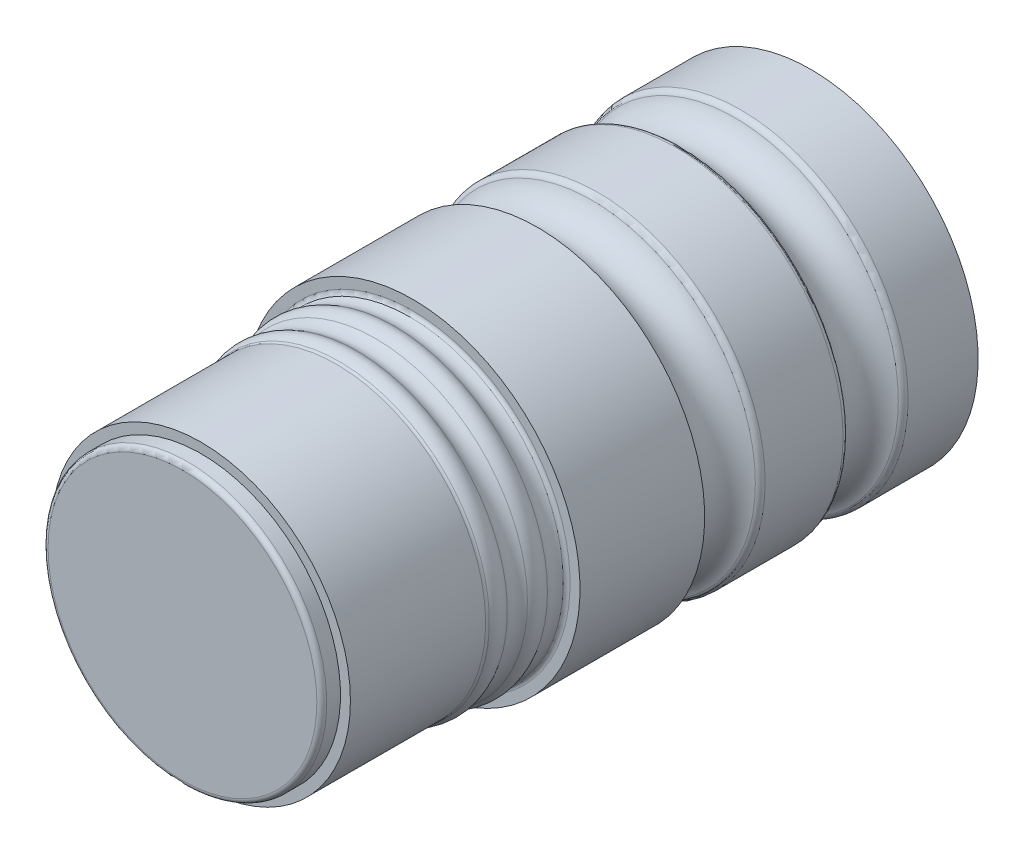
ISO-10303-21;
HEADER;
FILE_DESCRIPTION(('STEP AP214'),'2;1');
FILE_NAME('part.step','',(''),(''),'','','');
FILE_SCHEMA(('AUTOMOTIVE_DESIGN { 1 0 10303 214 1 1 1 1 }'));
ENDSEC;
DATA;
#1=APPLICATION_CONTEXT('core data for automotive mechanical design processes');
#2=APPLICATION_PROTOCOL_DEFINITION('international standard','automotive_design',2000,#1);
#3=PRODUCT_CONTEXT('',#1,'mechanical');
#4=PRODUCT('Part','Part','',(#3));
#5=PRODUCT_RELATED_PRODUCT_CATEGORY('part','',(#4));
#6=PRODUCT_DEFINITION_FORMATION('','',#4);
#7=PRODUCT_DEFINITION_CONTEXT('part definition',#1,'design');
#8=PRODUCT_DEFINITION('design','',#6,#7);
#9=PRODUCT_DEFINITION_SHAPE('','',#8);
#10=(LENGTH_UNIT() NAMED_UNIT(*) SI_UNIT(.MILLI.,.METRE.));
#11=(NAMED_UNIT(*) PLANE_ANGLE_UNIT() SI_UNIT($,.RADIAN.));
#12=(NAMED_UNIT(*) SI_UNIT($,.STERADIAN.) SOLID_ANGLE_UNIT());
#13=UNCERTAINTY_MEASURE_WITH_UNIT(LENGTH_MEASURE(1.E-05),#10,'distance_accuracy_value','');
#14=(GEOMETRIC_REPRESENTATION_CONTEXT(3) GLOBAL_UNCERTAINTY_ASSIGNED_CONTEXT((#13)) GLOBAL_UNIT_ASSIGNED_CONTEXT((#10,
#11,#12)) REPRESENTATION_CONTEXT('',''));
#15=CARTESIAN_POINT('',(0.,0.,0.));
#16=DIRECTION('',(0.,0.,1.));
#17=DIRECTION('',(1.,0.,0.));
#18=AXIS2_PLACEMENT_3D('',#15,#16,#17);
#19=CARTESIAN_POINT('',(0.,0.,0.174736771617149));
#20=DIRECTION('',(0.,0.,-1.));
#21=DIRECTION('',(-1.,0.,0.));
#22=AXIS2_PLACEMENT_3D('',#19,#20,#21);
#23=TOROIDAL_SURFACE('',#22,11.0527402882287,1.256328125);
#24=CARTESIAN_POINT('',(0.,0.,0.905546273933992));
#25=DIRECTION('',(0.,0.,-1.));
#26=DIRECTION('',(-1.,0.,0.));
#27=AXIS2_PLACEMENT_3D('',#24,#25,#26);
#28=CIRCLE('',#27,12.0746394168071);
#29=CARTESIAN_POINT('',(-12.0746394168071,0.,0.905546273933993));
#30=VERTEX_POINT('',#29);
#31=EDGE_CURVE('E47',#30,#30,#28,.T.);
#32=ORIENTED_EDGE('',*,*,#31,.T.);
#33=EDGE_LOOP('',(#32));
#34=FACE_BOUND('',#33,.T.);
#35=CARTESIAN_POINT('',(0.,0.,-0.5));
#36=DIRECTION('',(0.,0.,-1.));
#37=DIRECTION('',(-1.,0.,0.));
#38=AXIS2_PLACEMENT_3D('',#35,#36,#37);
#39=CIRCLE('',#38,12.1125);
#40=CARTESIAN_POINT('',(-12.1125,0.,-0.499999999999998));
#41=VERTEX_POINT('',#40);
#42=EDGE_CURVE('E103',#41,#41,#39,.T.);
#43=ORIENTED_EDGE('',*,*,#42,.F.);
#44=EDGE_LOOP('',(#43));
#45=FACE_BOUND('',#44,.T.);
#46=ADVANCED_FACE('F39',(#34,#45),#23,.T.);
#47=CARTESIAN_POINT('',(0.,0.,-1.17473677161715));
#48=DIRECTION('',(0.,0.,-1.));
#49=DIRECTION('',(-1.,0.,0.));
#50=AXIS2_PLACEMENT_3D('',#47,#48,#49);
#51=TOROIDAL_SURFACE('',#50,13.1722597117713,1.256328125);
#52=CARTESIAN_POINT('',(0.,0.,-2.));
#53=DIRECTION('',(0.,0.,-1.));
#54=DIRECTION('',(-1.,0.,0.));
#55=AXIS2_PLACEMENT_3D('',#52,#53,#54);
#56=CIRCLE('',#55,12.225);
#57=CARTESIAN_POINT('',(-12.225,0.,-2.));
#58=VERTEX_POINT('',#57);
#59=EDGE_CURVE('E107',#58,#58,#56,.T.);
#60=ORIENTED_EDGE('',*,*,#59,.F.);
#61=EDGE_LOOP('',(#60));
#62=FACE_BOUND('',#61,.T.);
#63=ORIENTED_EDGE('',*,*,#42,.T.);
#64=EDGE_LOOP('',(#63));
#65=FACE_BOUND('',#64,.T.);
#66=ADVANCED_FACE('F145',(#62,#65),#51,.F.);
#67=CARTESIAN_POINT('',(0.,0.,-2.82526322838285));
#68=DIRECTION('',(0.,0.,-1.));
#69=DIRECTION('',(-1.,0.,0.));
#70=AXIS2_PLACEMENT_3D('',#67,#68,#69);
#71=TOROIDAL_SURFACE('',#70,11.2777402882286,1.256328125);
#72=CARTESIAN_POINT('',(0.,0.,-3.5));
#73=DIRECTION('',(0.,0.,-1.));
#74=DIRECTION('',(-1.,0.,0.));
#75=AXIS2_PLACEMENT_3D('',#72,#73,#74);
#76=CIRCLE('',#75,12.3375);
#77=CARTESIAN_POINT('',(-12.3375,0.,-3.49999999999999));
#78=VERTEX_POINT('',#77);
#79=EDGE_CURVE('E111',#78,#78,#76,.T.);
#80=ORIENTED_EDGE('',*,*,#79,.F.);
#81=EDGE_LOOP('',(#80));
#82=FACE_BOUND('',#81,.T.);
#83=ORIENTED_EDGE('',*,*,#59,.T.);
#84=EDGE_LOOP('',(#83));
#85=FACE_BOUND('',#84,.T.);
#86=ADVANCED_FACE('F150',(#82,#85),#71,.T.);
#87=CARTESIAN_POINT('',(0.,0.,-4.17473677161715));
#88=DIRECTION('',(0.,0.,-1.));
#89=DIRECTION('',(-1.,0.,0.));
#90=AXIS2_PLACEMENT_3D('',#87,#88,#89);
#91=TOROIDAL_SURFACE('',#90,13.3972597117713,1.256328125);
#92=CARTESIAN_POINT('',(0.,0.,-4.79864498944623));
#93=DIRECTION('',(0.,0.,1.));
#94=DIRECTION('',(1.,0.,0.));
#95=AXIS2_PLACEMENT_3D('',#92,#93,#94);
#96=CIRCLE('',#95,12.3068016000626);
#97=CARTESIAN_POINT('',(12.3068016000626,0.,-4.79864498944623));
#98=VERTEX_POINT('',#97);
#99=EDGE_CURVE('E52',#98,#98,#96,.T.);
#100=ORIENTED_EDGE('',*,*,#99,.T.);
#101=EDGE_LOOP('',(#100));
#102=FACE_BOUND('',#101,.T.);
#103=ORIENTED_EDGE('',*,*,#79,.T.);
#104=EDGE_LOOP('',(#103));
#105=FACE_BOUND('',#104,.T.);
#106=ADVANCED_FACE('F200',(#102,#105),#91,.F.);
#107=CARTESIAN_POINT('',(12.45,0.,-5.));
#108=DIRECTION('',(0.,0.,-1.));
#109=DIRECTION('',(-1.,0.,0.));
#110=AXIS2_PLACEMENT_3D('',#107,#108,#109);
#111=PLANE('',#110);
#112=CARTESIAN_POINT('',(0.,0.,-5.));
#113=DIRECTION('',(0.,0.,-1.));
#114=DIRECTION('',(-1.,0.,0.));
#115=AXIS2_PLACEMENT_3D('',#112,#113,#114);
#116=CIRCLE('',#115,12.6539905517415);
#117=CARTESIAN_POINT('',(-12.6539905517415,0.,-4.99999999999999));
#118=VERTEX_POINT('',#117);
#119=EDGE_CURVE('E57',#118,#118,#116,.T.);
#120=ORIENTED_EDGE('',*,*,#119,.T.);
#121=EDGE_LOOP('',(#120));
#122=FACE_BOUND('',#121,.T.);
#123=CARTESIAN_POINT('',(0.,0.,-5.));
#124=DIRECTION('',(0.,0.,-1.));
#125=DIRECTION('',(-1.,0.,0.));
#126=AXIS2_PLACEMENT_3D('',#123,#124,#125);
#127=CIRCLE('',#126,13.45);
#128=CARTESIAN_POINT('',(-13.45,0.,-4.99999999999999));
#129=VERTEX_POINT('',#128);
#130=EDGE_CURVE('E115',#129,#129,#127,.T.);
#131=ORIENTED_EDGE('',*,*,#130,.F.);
#132=EDGE_LOOP('',(#131));
#133=FACE_BOUND('',#132,.T.);
#134=ADVANCED_FACE('F196',(#122,#133),#111,.F.);
#135=CARTESIAN_POINT('',(0.,0.,-37.));
#136=DIRECTION('',(0.,0.,-1.));
#137=DIRECTION('',(-1.,0.,0.));
#138=AXIS2_PLACEMENT_3D('',#135,#136,#137);
#139=CYLINDRICAL_SURFACE('',#138,13.45);
#140=CARTESIAN_POINT('',(0.,0.,-15.0200222717425));
#141=DIRECTION('',(0.,0.,-1.));
#142=DIRECTION('',(-1.,0.,0.));
#143=AXIS2_PLACEMENT_3D('',#140,#141,#142);
#144=CIRCLE('',#143,13.45);
#145=CARTESIAN_POINT('',(-13.45,0.,-15.0200222717425));
#146=VERTEX_POINT('',#145);
#147=EDGE_CURVE('E119',#146,#146,#144,.T.);
#148=ORIENTED_EDGE('',*,*,#147,.F.);
#149=EDGE_LOOP('',(#148));
#150=FACE_BOUND('',#149,.T.);
#151=ORIENTED_EDGE('',*,*,#130,.T.);
#152=EDGE_LOOP('',(#151));
#153=FACE_BOUND('',#152,.T.);
#154=ADVANCED_FACE('F199',(#150,#153),#139,.T.);
#155=CARTESIAN_POINT('',(0.,0.,-17.2650167038069));
#156=DIRECTION('',(0.,0.,-1.));
#157=DIRECTION('',(-1.,0.,0.));
#158=AXIS2_PLACEMENT_3D('',#155,#156,#157);
#159=TOROIDAL_SURFACE('',#158,13.95,2.3);
#160=CARTESIAN_POINT('',(0.,0.,-19.4133311831234));
#161=DIRECTION('',(0.,0.,1.));
#162=DIRECTION('',(1.,0.,0.));
#163=AXIS2_PLACEMENT_3D('',#160,#161,#162);
#164=CIRCLE('',#163,13.1285714285714);
#165=CARTESIAN_POINT('',(13.1285714285714,0.,-19.4133311831234));
#166=VERTEX_POINT('',#165);
#167=EDGE_CURVE('E83',#166,#166,#164,.T.);
#168=ORIENTED_EDGE('',*,*,#167,.T.);
#169=EDGE_LOOP('',(#168));
#170=FACE_BOUND('',#169,.T.);
#171=ORIENTED_EDGE('',*,*,#147,.T.);
#172=EDGE_LOOP('',(#171));
#173=FACE_BOUND('',#172,.T.);
#174=ADVANCED_FACE('F205',(#170,#173),#159,.F.);
#175=CARTESIAN_POINT('',(0.,0.,-37.));
#176=DIRECTION('',(0.,0.,-1.));
#177=DIRECTION('',(-1.,0.,0.));
#178=AXIS2_PLACEMENT_3D('',#175,#176,#177);
#179=CYLINDRICAL_SURFACE('',#178,13.45);
#180=CARTESIAN_POINT('',(0.,0.,-19.8803560699313));
#181=DIRECTION('',(0.,0.,1.));
#182=DIRECTION('',(1.,0.,0.));
#183=AXIS2_PLACEMENT_3D('',#180,#181,#182);
#184=CIRCLE('',#183,13.45);
#185=CARTESIAN_POINT('',(13.45,0.,-19.8803560699313));
#186=VERTEX_POINT('',#185);
#187=EDGE_CURVE('E87',#186,#186,#184,.F.);
#188=ORIENTED_EDGE('',*,*,#187,.T.);
#189=EDGE_LOOP('',(#188));
#190=FACE_BOUND('',#189,.T.);
#191=CARTESIAN_POINT('',(0.,0.,-26.1396662018112));
#192=DIRECTION('',(0.,0.,1.));
#193=DIRECTION('',(1.,0.,0.));
#194=AXIS2_PLACEMENT_3D('',#191,#192,#193);
#195=CIRCLE('',#194,13.45);
#196=CARTESIAN_POINT('',(13.45,0.,-26.1396662018112));
#197=VERTEX_POINT('',#196);
#198=EDGE_CURVE('E91',#197,#197,#195,.T.);
#199=ORIENTED_EDGE('',*,*,#198,.T.);
#200=EDGE_LOOP('',(#199));
#201=FACE_BOUND('',#200,.T.);
#202=ADVANCED_FACE('F141',(#190,#201),#179,.T.);
#203=CARTESIAN_POINT('',(0.,0.,-28.7550055679356));
#204=DIRECTION('',(0.,0.,-1.));
#205=DIRECTION('',(-1.,0.,0.));
#206=AXIS2_PLACEMENT_3D('',#203,#204,#205);
#207=TOROIDAL_SURFACE('',#206,13.95,2.3);
#208=CARTESIAN_POINT('',(0.,0.,-26.6066910886191));
#209=DIRECTION('',(0.,0.,-1.));
#210=DIRECTION('',(-1.,0.,0.));
#211=AXIS2_PLACEMENT_3D('',#208,#209,#210);
#212=CIRCLE('',#211,13.1285714285714);
#213=CARTESIAN_POINT('',(-13.1285714285714,0.,-26.6066910886191));
#214=VERTEX_POINT('',#213);
#215=EDGE_CURVE('E75',#214,#214,#212,.T.);
#216=ORIENTED_EDGE('',*,*,#215,.T.);
#217=EDGE_LOOP('',(#216));
#218=FACE_BOUND('',#217,.T.);
#219=CARTESIAN_POINT('',(0.,0.,-30.9033200472521));
#220=DIRECTION('',(0.,0.,1.));
#221=DIRECTION('',(1.,0.,0.));
#222=AXIS2_PLACEMENT_3D('',#219,#220,#221);
#223=CIRCLE('',#222,13.1285714285714);
#224=CARTESIAN_POINT('',(13.1285714285714,0.,-30.9033200472521));
#225=VERTEX_POINT('',#224);
#226=EDGE_CURVE('E79',#225,#225,#223,.T.);
#227=ORIENTED_EDGE('',*,*,#226,.T.);
#228=EDGE_LOOP('',(#227));
#229=FACE_BOUND('',#228,.T.);
#230=ADVANCED_FACE('F132',(#218,#229),#207,.F.);
#231=CARTESIAN_POINT('',(0.,0.,-37.));
#232=DIRECTION('',(0.,0.,-1.));
#233=DIRECTION('',(-1.,0.,0.));
#234=AXIS2_PLACEMENT_3D('',#231,#232,#233);
#235=CYLINDRICAL_SURFACE('',#234,13.45);
#236=CARTESIAN_POINT('',(0.,0.,-31.37034493406));
#237=DIRECTION('',(0.,0.,1.));
#238=DIRECTION('',(1.,0.,0.));
#239=AXIS2_PLACEMENT_3D('',#236,#237,#238);
#240=CIRCLE('',#239,13.45);
#241=CARTESIAN_POINT('',(13.45,0.,-31.37034493406));
#242=VERTEX_POINT('',#241);
#243=EDGE_CURVE('E71',#242,#242,#240,.F.);
#244=ORIENTED_EDGE('',*,*,#243,.T.);
#245=EDGE_LOOP('',(#244));
#246=FACE_BOUND('',#245,.T.);
#247=CARTESIAN_POINT('',(0.,0.,-37.));
#248=DIRECTION('',(0.,0.,-1.));
#249=DIRECTION('',(-1.,0.,0.));
#250=AXIS2_PLACEMENT_3D('',#247,#248,#249);
#251=CIRCLE('',#250,13.45);
#252=CARTESIAN_POINT('',(-13.45,0.,-37.));
#253=VERTEX_POINT('',#252);
#254=EDGE_CURVE('E123',#253,#253,#251,.T.);
#255=ORIENTED_EDGE('',*,*,#254,.F.);
#256=EDGE_LOOP('',(#255));
#257=FACE_BOUND('',#256,.T.);
#258=ADVANCED_FACE('F130',(#246,#257),#235,.T.);
#259=CARTESIAN_POINT('',(13.45,0.,-37.));
#260=DIRECTION('',(0.,0.,1.));
#261=DIRECTION('',(1.,0.,0.));
#262=AXIS2_PLACEMENT_3D('',#259,#260,#261);
#263=PLANE('',#262);
#264=ORIENTED_EDGE('',*,*,#254,.T.);
#265=EDGE_LOOP('',(#264));
#266=FACE_BOUND('',#265,.T.);
#267=ADVANCED_FACE('F128',(#266),#263,.F.);
#268=CARTESIAN_POINT('',(0.,0.,12.));
#269=DIRECTION('',(0.,0.,1.));
#270=DIRECTION('',(1.,0.,0.));
#271=AXIS2_PLACEMENT_3D('',#268,#269,#270);
#272=PLANE('',#271);
#273=CARTESIAN_POINT('',(0.,0.,12.));
#274=DIRECTION('',(0.,0.,1.));
#275=DIRECTION('',(1.,0.,0.));
#276=AXIS2_PLACEMENT_3D('',#273,#274,#275);
#277=CIRCLE('',#276,12.);
#278=CARTESIAN_POINT('',(12.,0.,12.));
#279=VERTEX_POINT('',#278);
#280=EDGE_CURVE('E95',#279,#279,#277,.T.);
#281=ORIENTED_EDGE('',*,*,#280,.T.);
#282=EDGE_LOOP('',(#281));
#283=FACE_BOUND('',#282,.T.);
#284=CARTESIAN_POINT('',(0.,0.,12.));
#285=DIRECTION('',(0.,0.,-1.));
#286=DIRECTION('',(-1.,0.,0.));
#287=AXIS2_PLACEMENT_3D('',#284,#285,#286);
#288=CIRCLE('',#287,11.2);
#289=CARTESIAN_POINT('',(-11.2,0.,12.));
#290=VERTEX_POINT('',#289);
#291=EDGE_CURVE('E99',#290,#290,#288,.T.);
#292=ORIENTED_EDGE('',*,*,#291,.T.);
#293=EDGE_LOOP('',(#292));
#294=FACE_BOUND('',#293,.T.);
#295=ADVANCED_FACE('F139',(#283,#294),#272,.T.);
#296=CARTESIAN_POINT('',(0.,0.,12.));
#297=DIRECTION('',(0.,0.,-1.));
#298=DIRECTION('',(-1.,0.,0.));
#299=AXIS2_PLACEMENT_3D('',#296,#297,#298);
#300=CYLINDRICAL_SURFACE('',#299,12.);
#301=CARTESIAN_POINT('',(0.,0.,1.13822736664362));
#302=DIRECTION('',(0.,0.,-1.));
#303=DIRECTION('',(-1.,0.,0.));
#304=AXIS2_PLACEMENT_3D('',#301,#302,#303);
#305=CIRCLE('',#304,12.);
#306=CARTESIAN_POINT('',(-12.,0.,1.13822736664362));
#307=VERTEX_POINT('',#306);
#308=EDGE_CURVE('E10',#307,#307,#305,.F.);
#309=ORIENTED_EDGE('',*,*,#308,.T.);
#310=EDGE_LOOP('',(#309));
#311=FACE_BOUND('',#310,.T.);
#312=ORIENTED_EDGE('',*,*,#280,.F.);
#313=EDGE_LOOP('',(#312));
#314=FACE_BOUND('',#313,.T.);
#315=ADVANCED_FACE('F164',(#311,#314),#300,.T.);
#316=CARTESIAN_POINT('',(11.2,0.,13.5));
#317=DIRECTION('',(0.,0.,-1.));
#318=DIRECTION('',(-1.,0.,0.));
#319=AXIS2_PLACEMENT_3D('',#316,#317,#318);
#320=PLANE('',#319);
#321=CARTESIAN_POINT('',(0.,0.,13.5));
#322=DIRECTION('',(0.,0.,-1.));
#323=DIRECTION('',(-1.,0.,0.));
#324=AXIS2_PLACEMENT_3D('',#321,#322,#323);
#325=CIRCLE('',#324,10.8);
#326=CARTESIAN_POINT('',(-10.8,0.,13.5));
#327=VERTEX_POINT('',#326);
#328=EDGE_CURVE('E63',#327,#327,#325,.F.);
#329=ORIENTED_EDGE('',*,*,#328,.T.);
#330=EDGE_LOOP('',(#329));
#331=FACE_BOUND('',#330,.T.);
#332=ADVANCED_FACE('F160',(#331),#320,.F.);
#333=CARTESIAN_POINT('',(0.,0.,-37.));
#334=DIRECTION('',(0.,0.,-1.));
#335=DIRECTION('',(-1.,0.,0.));
#336=AXIS2_PLACEMENT_3D('',#333,#334,#335);
#337=CYLINDRICAL_SURFACE('',#336,11.2);
#338=CARTESIAN_POINT('',(0.,0.,13.1));
#339=DIRECTION('',(0.,0.,-1.));
#340=DIRECTION('',(-1.,0.,0.));
#341=AXIS2_PLACEMENT_3D('',#338,#339,#340);
#342=CIRCLE('',#341,11.2);
#343=CARTESIAN_POINT('',(-11.2,0.,13.1));
#344=VERTEX_POINT('',#343);
#345=EDGE_CURVE('E67',#344,#344,#342,.T.);
#346=ORIENTED_EDGE('',*,*,#345,.T.);
#347=EDGE_LOOP('',(#346));
#348=FACE_BOUND('',#347,.T.);
#349=ORIENTED_EDGE('',*,*,#291,.F.);
#350=EDGE_LOOP('',(#349));
#351=FACE_BOUND('',#350,.T.);
#352=ADVANCED_FACE('F156',(#348,#351),#337,.T.);
#353=CARTESIAN_POINT('',(0.,0.,-19.8803560699313));
#354=DIRECTION('',(0.,0.,1.));
#355=DIRECTION('',(1.,0.,0.));
#356=AXIS2_PLACEMENT_3D('',#353,#354,#355);
#357=TOROIDAL_SURFACE('',#356,12.95,0.5);
#358=ORIENTED_EDGE('',*,*,#167,.F.);
#359=EDGE_LOOP('',(#358));
#360=FACE_BOUND('',#359,.T.);
#361=ORIENTED_EDGE('',*,*,#187,.F.);
#362=EDGE_LOOP('',(#361));
#363=FACE_BOUND('',#362,.T.);
#364=ADVANCED_FACE('F159',(#360,#363),#357,.T.);
#365=CARTESIAN_POINT('',(0.,0.,-26.1396662018112));
#366=DIRECTION('',(0.,0.,1.));
#367=DIRECTION('',(1.,0.,0.));
#368=AXIS2_PLACEMENT_3D('',#365,#366,#367);
#369=TOROIDAL_SURFACE('',#368,12.95,0.5);
#370=ORIENTED_EDGE('',*,*,#198,.F.);
#371=EDGE_LOOP('',(#370));
#372=FACE_BOUND('',#371,.T.);
#373=ORIENTED_EDGE('',*,*,#215,.F.);
#374=EDGE_LOOP('',(#373));
#375=FACE_BOUND('',#374,.T.);
#376=ADVANCED_FACE('F173',(#372,#375),#369,.T.);
#377=CARTESIAN_POINT('',(0.,0.,-31.37034493406));
#378=DIRECTION('',(0.,0.,1.));
#379=DIRECTION('',(1.,0.,0.));
#380=AXIS2_PLACEMENT_3D('',#377,#378,#379);
#381=TOROIDAL_SURFACE('',#380,12.95,0.5);
#382=ORIENTED_EDGE('',*,*,#226,.F.);
#383=EDGE_LOOP('',(#382));
#384=FACE_BOUND('',#383,.T.);
#385=ORIENTED_EDGE('',*,*,#243,.F.);
#386=EDGE_LOOP('',(#385));
#387=FACE_BOUND('',#386,.T.);
#388=ADVANCED_FACE('F177',(#384,#387),#381,.T.);
#389=CARTESIAN_POINT('',(0.,0.,13.1));
#390=DIRECTION('',(0.,0.,-1.));
#391=DIRECTION('',(-1.,0.,0.));
#392=AXIS2_PLACEMENT_3D('',#389,#390,#391);
#393=TOROIDAL_SURFACE('',#392,10.8,0.4);
#394=ORIENTED_EDGE('',*,*,#328,.F.);
#395=EDGE_LOOP('',(#394));
#396=FACE_BOUND('',#395,.T.);
#397=ORIENTED_EDGE('',*,*,#345,.F.);
#398=EDGE_LOOP('',(#397));
#399=FACE_BOUND('',#398,.T.);
#400=ADVANCED_FACE('F181',(#396,#399),#393,.T.);
#401=CARTESIAN_POINT('',(0.,0.,-4.6));
#402=DIRECTION('',(0.,0.,1.));
#403=DIRECTION('',(1.,0.,0.));
#404=AXIS2_PLACEMENT_3D('',#401,#402,#403);
#405=TOROIDAL_SURFACE('',#404,12.6539905517415,0.4);
#406=ORIENTED_EDGE('',*,*,#99,.F.);
#407=EDGE_LOOP('',(#406));
#408=FACE_BOUND('',#407,.T.);
#409=ORIENTED_EDGE('',*,*,#119,.F.);
#410=EDGE_LOOP('',(#409));
#411=FACE_BOUND('',#410,.T.);
#412=ADVANCED_FACE('F184',(#408,#411),#405,.F.);
#413=CARTESIAN_POINT('',(0.,0.,1.13822736664362));
#414=DIRECTION('',(0.,0.,-1.));
#415=DIRECTION('',(-1.,0.,0.));
#416=AXIS2_PLACEMENT_3D('',#413,#414,#415);
#417=TOROIDAL_SURFACE('',#416,12.3999999999999,0.4);
#418=ORIENTED_EDGE('',*,*,#308,.F.);
#419=EDGE_LOOP('',(#418));
#420=FACE_BOUND('',#419,.T.);
#421=ORIENTED_EDGE('',*,*,#31,.F.);
#422=EDGE_LOOP('',(#421));
#423=FACE_BOUND('',#422,.T.);
#424=ADVANCED_FACE('F41',(#420,#423),#417,.F.);
#425=CLOSED_SHELL('',(#46,#66,#86,#106,#134,#154,#174,#202,#230,#258,#267,#295,#315,#332,#352,
#364,#376,#388,#400,#412,#424));
#426=MANIFOLD_SOLID_BREP('B2',#425);
#427=ADVANCED_BREP_SHAPE_REPRESENTATION('',(#18,#426),#14);
#428=SHAPE_DEFINITION_REPRESENTATION(#9,#427);
ENDSEC;
END-ISO-10303-21;
